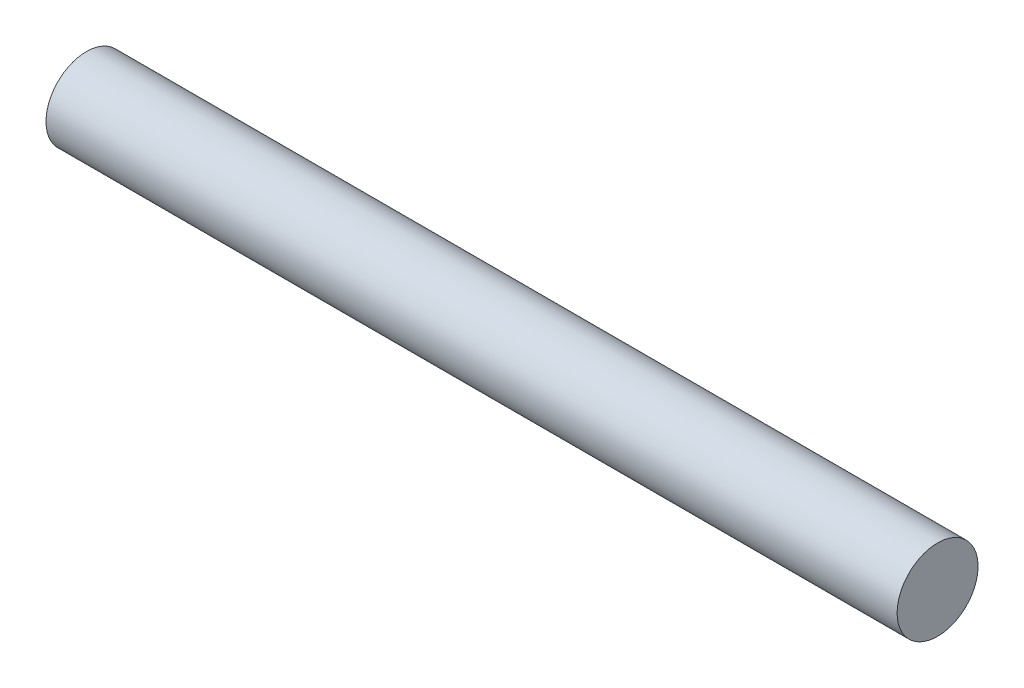
ISO-10303-21;
HEADER;
FILE_DESCRIPTION(('STEP AP214'),'2;1');
FILE_NAME('part.step','',(''),(''),'','','');
FILE_SCHEMA(('AUTOMOTIVE_DESIGN { 1 0 10303 214 1 1 1 1 }'));
ENDSEC;
DATA;
#1=APPLICATION_CONTEXT('core data for automotive mechanical design processes');
#2=APPLICATION_PROTOCOL_DEFINITION('international standard','automotive_design',2000,#1);
#3=PRODUCT_CONTEXT('',#1,'mechanical');
#4=PRODUCT('Part','Part','',(#3));
#5=PRODUCT_RELATED_PRODUCT_CATEGORY('part','',(#4));
#6=PRODUCT_DEFINITION_FORMATION('','',#4);
#7=PRODUCT_DEFINITION_CONTEXT('part definition',#1,'design');
#8=PRODUCT_DEFINITION('design','',#6,#7);
#9=PRODUCT_DEFINITION_SHAPE('','',#8);
#10=(LENGTH_UNIT() NAMED_UNIT(*) SI_UNIT(.MILLI.,.METRE.));
#11=(NAMED_UNIT(*) PLANE_ANGLE_UNIT() SI_UNIT($,.RADIAN.));
#12=(NAMED_UNIT(*) SI_UNIT($,.STERADIAN.) SOLID_ANGLE_UNIT());
#13=UNCERTAINTY_MEASURE_WITH_UNIT(LENGTH_MEASURE(1.E-05),#10,'distance_accuracy_value','');
#14=(GEOMETRIC_REPRESENTATION_CONTEXT(3) GLOBAL_UNCERTAINTY_ASSIGNED_CONTEXT((#13)) GLOBAL_UNIT_ASSIGNED_CONTEXT((#10,
#11,#12)) REPRESENTATION_CONTEXT('',''));
#15=CARTESIAN_POINT('',(0.,0.,0.));
#16=DIRECTION('',(0.,0.,1.));
#17=DIRECTION('',(1.,0.,0.));
#18=AXIS2_PLACEMENT_3D('',#15,#16,#17);
#19=CARTESIAN_POINT('',(0.,0.,0.));
#20=DIRECTION('',(1.,0.,0.));
#21=DIRECTION('',(0.,0.,-1.));
#22=AXIS2_PLACEMENT_3D('',#19,#20,#21);
#23=PLANE('',#22);
#24=CARTESIAN_POINT('',(0.,0.,0.));
#25=DIRECTION('',(-1.,0.,0.));
#26=DIRECTION('',(0.,0.,1.));
#27=AXIS2_PLACEMENT_3D('',#24,#25,#26);
#28=CIRCLE('',#27,25.4);
#29=CARTESIAN_POINT('',(0.,0.,25.4));
#30=VERTEX_POINT('',#29);
#31=EDGE_CURVE('E10',#30,#30,#28,.T.);
#32=ORIENTED_EDGE('',*,*,#31,.T.);
#33=EDGE_LOOP('',(#32));
#34=FACE_BOUND('',#33,.T.);
#35=ADVANCED_FACE('F33',(#34),#23,.F.);
#36=CARTESIAN_POINT('',(-28.208709424894,0.,0.));
#37=DIRECTION('',(-1.,0.,0.));
#38=DIRECTION('',(0.,0.,1.));
#39=AXIS2_PLACEMENT_3D('',#36,#37,#38);
#40=CYLINDRICAL_SURFACE('',#39,25.4);
#41=ORIENTED_EDGE('',*,*,#31,.F.);
#42=EDGE_LOOP('',(#41));
#43=FACE_BOUND('',#42,.T.);
#44=CARTESIAN_POINT('',(534.,0.,0.));
#45=DIRECTION('',(-1.,0.,0.));
#46=DIRECTION('',(0.,0.,1.));
#47=AXIS2_PLACEMENT_3D('',#44,#45,#46);
#48=CIRCLE('',#47,25.4);
#49=CARTESIAN_POINT('',(534.,0.,25.4));
#50=VERTEX_POINT('',#49);
#51=EDGE_CURVE('E39',#50,#50,#48,.T.);
#52=ORIENTED_EDGE('',*,*,#51,.T.);
#53=EDGE_LOOP('',(#52));
#54=FACE_BOUND('',#53,.T.);
#55=ADVANCED_FACE('F45',(#43,#54),#40,.T.);
#56=CARTESIAN_POINT('',(534.,0.,0.));
#57=DIRECTION('',(-1.,0.,0.));
#58=DIRECTION('',(0.,0.,1.));
#59=AXIS2_PLACEMENT_3D('',#56,#57,#58);
#60=PLANE('',#59);
#61=ORIENTED_EDGE('',*,*,#51,.F.);
#62=EDGE_LOOP('',(#61));
#63=FACE_BOUND('',#62,.T.);
#64=ADVANCED_FACE('F47',(#63),#60,.F.);
#65=CLOSED_SHELL('',(#35,#55,#64));
#66=MANIFOLD_SOLID_BREP('B2',#65);
#67=ADVANCED_BREP_SHAPE_REPRESENTATION('',(#18,#66),#14);
#68=SHAPE_DEFINITION_REPRESENTATION(#9,#67);
ENDSEC;
END-ISO-10303-21;
